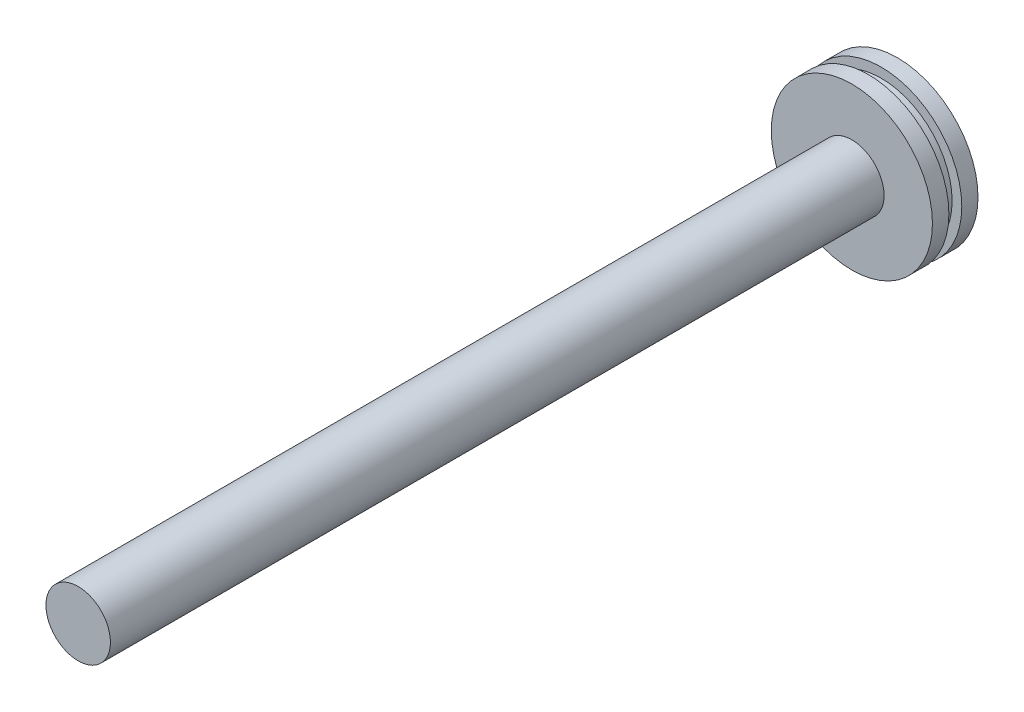
ISO-10303-21;
HEADER;
FILE_DESCRIPTION(('STEP AP214'),'2;1');
FILE_NAME('part.step','',(''),(''),'','','');
FILE_SCHEMA(('AUTOMOTIVE_DESIGN { 1 0 10303 214 1 1 1 1 }'));
ENDSEC;
DATA;
#1=APPLICATION_CONTEXT('core data for automotive mechanical design processes');
#2=APPLICATION_PROTOCOL_DEFINITION('international standard','automotive_design',2000,#1);
#3=PRODUCT_CONTEXT('',#1,'mechanical');
#4=PRODUCT('Part','Part','',(#3));
#5=PRODUCT_RELATED_PRODUCT_CATEGORY('part','',(#4));
#6=PRODUCT_DEFINITION_FORMATION('','',#4);
#7=PRODUCT_DEFINITION_CONTEXT('part definition',#1,'design');
#8=PRODUCT_DEFINITION('design','',#6,#7);
#9=PRODUCT_DEFINITION_SHAPE('','',#8);
#10=(LENGTH_UNIT() NAMED_UNIT(*) SI_UNIT(.MILLI.,.METRE.));
#11=(NAMED_UNIT(*) PLANE_ANGLE_UNIT() SI_UNIT($,.RADIAN.));
#12=(NAMED_UNIT(*) SI_UNIT($,.STERADIAN.) SOLID_ANGLE_UNIT());
#13=UNCERTAINTY_MEASURE_WITH_UNIT(LENGTH_MEASURE(1.E-05),#10,'distance_accuracy_value','');
#14=(GEOMETRIC_REPRESENTATION_CONTEXT(3) GLOBAL_UNCERTAINTY_ASSIGNED_CONTEXT((#13)) GLOBAL_UNIT_ASSIGNED_CONTEXT((#10,
#11,#12)) REPRESENTATION_CONTEXT('',''));
#15=CARTESIAN_POINT('',(0.,0.,0.));
#16=DIRECTION('',(0.,0.,1.));
#17=DIRECTION('',(1.,0.,0.));
#18=AXIS2_PLACEMENT_3D('',#15,#16,#17);
#19=CARTESIAN_POINT('',(0.,0.,-70.65));
#20=DIRECTION('',(0.,0.,1.));
#21=DIRECTION('',(1.,0.,0.));
#22=AXIS2_PLACEMENT_3D('',#19,#20,#21);
#23=CYLINDRICAL_SURFACE('',#22,125.);
#24=CARTESIAN_POINT('',(0.,0.,0.));
#25=DIRECTION('',(0.,0.,-1.));
#26=DIRECTION('',(-1.,0.,0.));
#27=AXIS2_PLACEMENT_3D('',#24,#25,#26);
#28=CIRCLE('',#27,125.);
#29=CARTESIAN_POINT('',(-125.,0.,0.));
#30=VERTEX_POINT('',#29);
#31=EDGE_CURVE('E44',#30,#30,#28,.T.);
#32=ORIENTED_EDGE('',*,*,#31,.T.);
#33=EDGE_LOOP('',(#32));
#34=FACE_BOUND('',#33,.T.);
#35=CARTESIAN_POINT('',(0.,0.,-25.4865945645517));
#36=DIRECTION('',(0.,0.,1.));
#37=DIRECTION('',(1.,0.,0.));
#38=AXIS2_PLACEMENT_3D('',#35,#36,#37);
#39=CIRCLE('',#38,125.);
#40=CARTESIAN_POINT('',(125.,0.,-25.4865945645517));
#41=VERTEX_POINT('',#40);
#42=EDGE_CURVE('E55',#41,#41,#39,.T.);
#43=ORIENTED_EDGE('',*,*,#42,.T.);
#44=EDGE_LOOP('',(#43));
#45=FACE_BOUND('',#44,.T.);
#46=ADVANCED_FACE('F31',(#34,#45),#23,.T.);
#47=CARTESIAN_POINT('',(0.,0.,1200.));
#48=DIRECTION('',(0.,0.,-1.));
#49=DIRECTION('',(-1.,0.,0.));
#50=AXIS2_PLACEMENT_3D('',#47,#48,#49);
#51=CYLINDRICAL_SURFACE('',#50,50.);
#52=CARTESIAN_POINT('',(0.,0.,1200.));
#53=DIRECTION('',(0.,0.,1.));
#54=DIRECTION('',(1.,0.,0.));
#55=AXIS2_PLACEMENT_3D('',#52,#53,#54);
#56=CIRCLE('',#55,50.);
#57=CARTESIAN_POINT('',(50.,0.,1200.));
#58=VERTEX_POINT('',#57);
#59=EDGE_CURVE('E10',#58,#58,#56,.T.);
#60=ORIENTED_EDGE('',*,*,#59,.F.);
#61=EDGE_LOOP('',(#60));
#62=FACE_BOUND('',#61,.T.);
#63=CARTESIAN_POINT('',(0.,0.,0.));
#64=DIRECTION('',(0.,0.,1.));
#65=DIRECTION('',(1.,0.,0.));
#66=AXIS2_PLACEMENT_3D('',#63,#64,#65);
#67=CIRCLE('',#66,50.);
#68=CARTESIAN_POINT('',(50.,0.,0.));
#69=VERTEX_POINT('',#68);
#70=EDGE_CURVE('E35',#69,#69,#67,.T.);
#71=ORIENTED_EDGE('',*,*,#70,.T.);
#72=EDGE_LOOP('',(#71));
#73=FACE_BOUND('',#72,.T.);
#74=ADVANCED_FACE('F33',(#62,#73),#51,.T.);
#75=CARTESIAN_POINT('',(0.,0.,1200.));
#76=DIRECTION('',(0.,0.,1.));
#77=DIRECTION('',(1.,0.,0.));
#78=AXIS2_PLACEMENT_3D('',#75,#76,#77);
#79=PLANE('',#78);
#80=ORIENTED_EDGE('',*,*,#59,.T.);
#81=EDGE_LOOP('',(#80));
#82=FACE_BOUND('',#81,.T.);
#83=ADVANCED_FACE('F83',(#82),#79,.T.);
#84=CARTESIAN_POINT('',(0.,0.,0.));
#85=DIRECTION('',(0.,0.,-1.));
#86=DIRECTION('',(-1.,0.,0.));
#87=AXIS2_PLACEMENT_3D('',#84,#85,#86);
#88=PLANE('',#87);
#89=ORIENTED_EDGE('',*,*,#70,.F.);
#90=EDGE_LOOP('',(#89));
#91=FACE_BOUND('',#90,.T.);
#92=ORIENTED_EDGE('',*,*,#31,.F.);
#93=EDGE_LOOP('',(#92));
#94=FACE_BOUND('',#93,.T.);
#95=ADVANCED_FACE('F100',(#91,#94),#88,.F.);
#96=CARTESIAN_POINT('',(-125.,0.,-45.4865945645517));
#97=DIRECTION('',(0.,0.,1.));
#98=DIRECTION('',(1.,0.,0.));
#99=AXIS2_PLACEMENT_3D('',#96,#97,#98);
#100=PLANE('',#99);
#101=CARTESIAN_POINT('',(0.,0.,-45.4865945645517));
#102=DIRECTION('',(0.,0.,1.));
#103=DIRECTION('',(1.,0.,0.));
#104=AXIS2_PLACEMENT_3D('',#101,#102,#103);
#105=CIRCLE('',#104,125.);
#106=CARTESIAN_POINT('',(125.,0.,-45.4865945645517));
#107=VERTEX_POINT('',#106);
#108=EDGE_CURVE('E58',#107,#107,#105,.T.);
#109=ORIENTED_EDGE('',*,*,#108,.T.);
#110=EDGE_LOOP('',(#109));
#111=FACE_BOUND('',#110,.T.);
#112=CARTESIAN_POINT('',(0.,0.,-45.4865945645517));
#113=DIRECTION('',(0.,0.,1.));
#114=DIRECTION('',(1.,0.,0.));
#115=AXIS2_PLACEMENT_3D('',#112,#113,#114);
#116=CIRCLE('',#115,110.);
#117=CARTESIAN_POINT('',(110.,0.,-45.4865945645517));
#118=VERTEX_POINT('',#117);
#119=EDGE_CURVE('E47',#118,#118,#116,.T.);
#120=ORIENTED_EDGE('',*,*,#119,.F.);
#121=EDGE_LOOP('',(#120));
#122=FACE_BOUND('',#121,.T.);
#123=ADVANCED_FACE('F62',(#111,#122),#100,.T.);
#124=CARTESIAN_POINT('',(0.,0.,1200.));
#125=DIRECTION('',(0.,0.,1.));
#126=DIRECTION('',(1.,0.,0.));
#127=AXIS2_PLACEMENT_3D('',#124,#125,#126);
#128=CYLINDRICAL_SURFACE('',#127,110.);
#129=ORIENTED_EDGE('',*,*,#119,.T.);
#130=EDGE_LOOP('',(#129));
#131=FACE_BOUND('',#130,.T.);
#132=CARTESIAN_POINT('',(0.,0.,-25.4865945645517));
#133=DIRECTION('',(0.,0.,1.));
#134=DIRECTION('',(1.,0.,0.));
#135=AXIS2_PLACEMENT_3D('',#132,#133,#134);
#136=CIRCLE('',#135,110.);
#137=CARTESIAN_POINT('',(110.,0.,-25.4865945645517));
#138=VERTEX_POINT('',#137);
#139=EDGE_CURVE('E52',#138,#138,#136,.T.);
#140=ORIENTED_EDGE('',*,*,#139,.F.);
#141=EDGE_LOOP('',(#140));
#142=FACE_BOUND('',#141,.T.);
#143=ADVANCED_FACE('F90',(#131,#142),#128,.T.);
#144=CARTESIAN_POINT('',(-110.,0.,-25.4865945645517));
#145=DIRECTION('',(0.,0.,-1.));
#146=DIRECTION('',(-1.,0.,0.));
#147=AXIS2_PLACEMENT_3D('',#144,#145,#146);
#148=PLANE('',#147);
#149=ORIENTED_EDGE('',*,*,#139,.T.);
#150=EDGE_LOOP('',(#149));
#151=FACE_BOUND('',#150,.T.);
#152=ORIENTED_EDGE('',*,*,#42,.F.);
#153=EDGE_LOOP('',(#152));
#154=FACE_BOUND('',#153,.T.);
#155=ADVANCED_FACE('F73',(#151,#154),#148,.T.);
#156=CARTESIAN_POINT('',(0.,0.,-70.65));
#157=DIRECTION('',(0.,0.,-1.));
#158=DIRECTION('',(-1.,0.,0.));
#159=AXIS2_PLACEMENT_3D('',#156,#157,#158);
#160=PLANE('',#159);
#161=CARTESIAN_POINT('',(0.,0.,-70.65));
#162=DIRECTION('',(0.,0.,-1.));
#163=DIRECTION('',(-1.,0.,0.));
#164=AXIS2_PLACEMENT_3D('',#161,#162,#163);
#165=CIRCLE('',#164,125.);
#166=CARTESIAN_POINT('',(-125.,0.,-70.65));
#167=VERTEX_POINT('',#166);
#168=EDGE_CURVE('E42',#167,#167,#165,.T.);
#169=ORIENTED_EDGE('',*,*,#168,.T.);
#170=EDGE_LOOP('',(#169));
#171=FACE_BOUND('',#170,.T.);
#172=ADVANCED_FACE('F67',(#171),#160,.T.);
#173=ORIENTED_EDGE('',*,*,#168,.F.);
#174=EDGE_LOOP('',(#173));
#175=FACE_BOUND('',#174,.T.);
#176=ORIENTED_EDGE('',*,*,#108,.F.);
#177=EDGE_LOOP('',(#176));
#178=FACE_BOUND('',#177,.T.);
#179=ADVANCED_FACE('F65',(#175,#178),#23,.T.);
#180=CLOSED_SHELL('',(#46,#74,#83,#95,#123,#143,#155,#172,#179));
#181=MANIFOLD_SOLID_BREP('B2',#180);
#182=ADVANCED_BREP_SHAPE_REPRESENTATION('',(#18,#181),#14);
#183=SHAPE_DEFINITION_REPRESENTATION(#9,#182);
ENDSEC;
END-ISO-10303-21;
